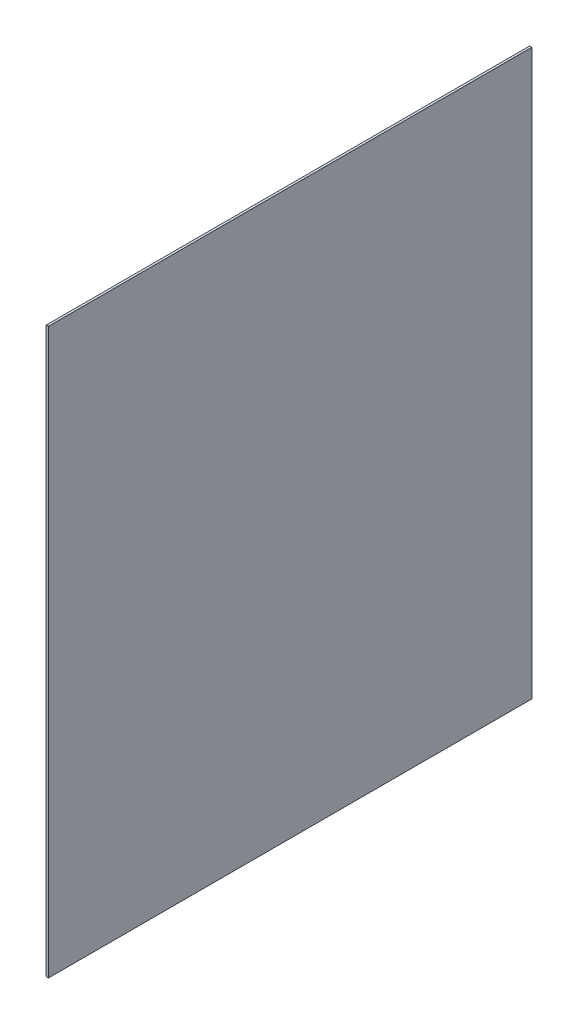
ISO-10303-21;
HEADER;
FILE_DESCRIPTION(('STEP AP214'),'2;1');
FILE_NAME('part.step','',(''),(''),'','','');
FILE_SCHEMA(('AUTOMOTIVE_DESIGN { 1 0 10303 214 1 1 1 1 }'));
ENDSEC;
DATA;
#1=APPLICATION_CONTEXT('core data for automotive mechanical design processes');
#2=APPLICATION_PROTOCOL_DEFINITION('international standard','automotive_design',2000,#1);
#3=PRODUCT_CONTEXT('',#1,'mechanical');
#4=PRODUCT('Part','Part','',(#3));
#5=PRODUCT_RELATED_PRODUCT_CATEGORY('part','',(#4));
#6=PRODUCT_DEFINITION_FORMATION('','',#4);
#7=PRODUCT_DEFINITION_CONTEXT('part definition',#1,'design');
#8=PRODUCT_DEFINITION('design','',#6,#7);
#9=PRODUCT_DEFINITION_SHAPE('','',#8);
#10=(LENGTH_UNIT() NAMED_UNIT(*) SI_UNIT(.MILLI.,.METRE.));
#11=(NAMED_UNIT(*) PLANE_ANGLE_UNIT() SI_UNIT($,.RADIAN.));
#12=(NAMED_UNIT(*) SI_UNIT($,.STERADIAN.) SOLID_ANGLE_UNIT());
#13=UNCERTAINTY_MEASURE_WITH_UNIT(LENGTH_MEASURE(1.E-05),#10,'distance_accuracy_value','');
#14=(GEOMETRIC_REPRESENTATION_CONTEXT(3) GLOBAL_UNCERTAINTY_ASSIGNED_CONTEXT((#13)) GLOBAL_UNIT_ASSIGNED_CONTEXT((#10,
#11,#12)) REPRESENTATION_CONTEXT('',''));
#15=CARTESIAN_POINT('',(0.,0.,0.));
#16=DIRECTION('',(0.,0.,1.));
#17=DIRECTION('',(1.,0.,0.));
#18=AXIS2_PLACEMENT_3D('',#15,#16,#17);
#19=CARTESIAN_POINT('',(1414.2,180.10748547765,159.995106228736));
#20=DIRECTION('',(0.,1.,0.));
#21=DIRECTION('',(0.,0.,1.));
#22=AXIS2_PLACEMENT_3D('',#19,#20,#21);
#23=PLANE('',#22);
#24=DIRECTION('',(0.,0.,-1.));
#25=VECTOR('',#24,1.);
#26=CARTESIAN_POINT('',(1412.7,180.10748547765,159.995106228736));
#27=LINE('',#26,#25);
#28=CARTESIAN_POINT('',(1412.7,180.10748547765,159.995106228736));
#29=VERTEX_POINT('',#28);
#30=CARTESIAN_POINT('',(1412.7,180.10748547765,-159.995106228736));
#31=VERTEX_POINT('',#30);
#32=EDGE_CURVE('E97',#29,#31,#27,.T.);
#33=ORIENTED_EDGE('',*,*,#32,.T.);
#34=DIRECTION('',(-1.,0.,0.));
#35=VECTOR('',#34,1.);
#36=CARTESIAN_POINT('',(1414.2,180.10748547765,-159.995106228736));
#37=LINE('',#36,#35);
#38=CARTESIAN_POINT('',(1414.2,180.10748547765,-159.995106228736));
#39=VERTEX_POINT('',#38);
#40=EDGE_CURVE('E11',#39,#31,#37,.T.);
#41=ORIENTED_EDGE('',*,*,#40,.F.);
#42=DIRECTION('',(0.,0.,-1.));
#43=VECTOR('',#42,1.);
#44=CARTESIAN_POINT('',(1414.2,180.10748547765,159.995106228736));
#45=LINE('',#44,#43);
#46=CARTESIAN_POINT('',(1414.2,180.10748547765,159.995106228736));
#47=VERTEX_POINT('',#46);
#48=EDGE_CURVE('E85',#47,#39,#45,.T.);
#49=ORIENTED_EDGE('',*,*,#48,.F.);
#50=DIRECTION('',(-1.,0.,0.));
#51=VECTOR('',#50,1.);
#52=CARTESIAN_POINT('',(1414.2,180.10748547765,159.995106228736));
#53=LINE('',#52,#51);
#54=EDGE_CURVE('E93',#47,#29,#53,.T.);
#55=ORIENTED_EDGE('',*,*,#54,.T.);
#56=EDGE_LOOP('',(#33,#41,#49,#55));
#57=FACE_BOUND('',#56,.T.);
#58=ADVANCED_FACE('F34',(#57),#23,.F.);
#59=CARTESIAN_POINT('',(1414.2,180.10748547765,-159.995106228736));
#60=DIRECTION('',(0.,3.51288808680108E-05,0.999999999382981));
#61=DIRECTION('',(0.,-0.999999999382981,3.51288808680108E-05));
#62=AXIS2_PLACEMENT_3D('',#59,#60,#61);
#63=PLANE('',#62);
#64=DIRECTION('',(0.,0.999999999382981,-3.51288808680108E-05));
#65=VECTOR('',#64,1.);
#66=CARTESIAN_POINT('',(1412.7,180.10748547765,-159.995106228736));
#67=LINE('',#66,#65);
#68=CARTESIAN_POINT('',(1412.7,553.761760902861,-160.008232285272));
#69=VERTEX_POINT('',#68);
#70=EDGE_CURVE('E89',#31,#69,#67,.T.);
#71=ORIENTED_EDGE('',*,*,#70,.T.);
#72=DIRECTION('',(-1.,0.,0.));
#73=VECTOR('',#72,1.);
#74=CARTESIAN_POINT('',(1414.2,553.761760902861,-160.008232285272));
#75=LINE('',#74,#73);
#76=CARTESIAN_POINT('',(1414.2,553.761760902861,-160.008232285272));
#77=VERTEX_POINT('',#76);
#78=EDGE_CURVE('E42',#77,#69,#75,.T.);
#79=ORIENTED_EDGE('',*,*,#78,.F.);
#80=DIRECTION('',(0.,0.999999999382981,-3.51288808680108E-05));
#81=VECTOR('',#80,1.);
#82=CARTESIAN_POINT('',(1414.2,180.10748547765,-159.995106228736));
#83=LINE('',#82,#81);
#84=EDGE_CURVE('E80',#39,#77,#83,.T.);
#85=ORIENTED_EDGE('',*,*,#84,.F.);
#86=ORIENTED_EDGE('',*,*,#40,.T.);
#87=EDGE_LOOP('',(#71,#79,#85,#86));
#88=FACE_BOUND('',#87,.T.);
#89=ADVANCED_FACE('F88',(#88),#63,.F.);
#90=CARTESIAN_POINT('',(1414.2,553.761760902861,-160.008232285272));
#91=DIRECTION('',(0.,-1.,0.));
#92=DIRECTION('',(0.,0.,-1.));
#93=AXIS2_PLACEMENT_3D('',#90,#91,#92);
#94=PLANE('',#93);
#95=DIRECTION('',(0.,0.,1.));
#96=VECTOR('',#95,1.);
#97=CARTESIAN_POINT('',(1412.7,553.761760902861,-160.008232285272));
#98=LINE('',#97,#96);
#99=CARTESIAN_POINT('',(1412.7,553.761760902861,160.008232285272));
#100=VERTEX_POINT('',#99);
#101=EDGE_CURVE('E67',#69,#100,#98,.T.);
#102=ORIENTED_EDGE('',*,*,#101,.T.);
#103=DIRECTION('',(-1.,0.,0.));
#104=VECTOR('',#103,1.);
#105=CARTESIAN_POINT('',(1414.2,553.761760902861,160.008232285272));
#106=LINE('',#105,#104);
#107=CARTESIAN_POINT('',(1414.2,553.761760902861,160.008232285272));
#108=VERTEX_POINT('',#107);
#109=EDGE_CURVE('E90',#108,#100,#106,.T.);
#110=ORIENTED_EDGE('',*,*,#109,.F.);
#111=DIRECTION('',(0.,0.,1.));
#112=VECTOR('',#111,1.);
#113=CARTESIAN_POINT('',(1414.2,553.761760902861,-160.008232285272));
#114=LINE('',#113,#112);
#115=EDGE_CURVE('E83',#77,#108,#114,.T.);
#116=ORIENTED_EDGE('',*,*,#115,.F.);
#117=ORIENTED_EDGE('',*,*,#78,.T.);
#118=EDGE_LOOP('',(#102,#110,#116,#117));
#119=FACE_BOUND('',#118,.T.);
#120=ADVANCED_FACE('F91',(#119),#94,.F.);
#121=CARTESIAN_POINT('',(1414.2,553.761760902861,160.008232285272));
#122=DIRECTION('',(0.,3.51288808680108E-05,-0.999999999382981));
#123=DIRECTION('',(0.,0.999999999382981,3.51288808680108E-05));
#124=AXIS2_PLACEMENT_3D('',#121,#122,#123);
#125=PLANE('',#124);
#126=DIRECTION('',(0.,-0.999999999382981,-3.51288808680108E-05));
#127=VECTOR('',#126,1.);
#128=CARTESIAN_POINT('',(1412.7,553.761760902861,160.008232285272));
#129=LINE('',#128,#127);
#130=EDGE_CURVE('E73',#100,#29,#129,.T.);
#131=ORIENTED_EDGE('',*,*,#130,.T.);
#132=ORIENTED_EDGE('',*,*,#54,.F.);
#133=DIRECTION('',(0.,-0.999999999382981,-3.51288808680108E-05));
#134=VECTOR('',#133,1.);
#135=CARTESIAN_POINT('',(1414.2,553.761760902861,160.008232285272));
#136=LINE('',#135,#134);
#137=EDGE_CURVE('E50',#108,#47,#136,.T.);
#138=ORIENTED_EDGE('',*,*,#137,.F.);
#139=ORIENTED_EDGE('',*,*,#109,.T.);
#140=EDGE_LOOP('',(#131,#132,#138,#139));
#141=FACE_BOUND('',#140,.T.);
#142=ADVANCED_FACE('F104',(#141),#125,.F.);
#143=CARTESIAN_POINT('',(1414.2,0.,0.));
#144=DIRECTION('',(1.,0.,0.));
#145=DIRECTION('',(0.,0.,-1.));
#146=AXIS2_PLACEMENT_3D('',#143,#144,#145);
#147=PLANE('',#146);
#148=ORIENTED_EDGE('',*,*,#48,.T.);
#149=ORIENTED_EDGE('',*,*,#84,.T.);
#150=ORIENTED_EDGE('',*,*,#115,.T.);
#151=ORIENTED_EDGE('',*,*,#137,.T.);
#152=EDGE_LOOP('',(#148,#149,#150,#151));
#153=FACE_BOUND('',#152,.T.);
#154=ADVANCED_FACE('F81',(#153),#147,.T.);
#155=CARTESIAN_POINT('',(1412.7,0.,0.));
#156=DIRECTION('',(1.,0.,0.));
#157=DIRECTION('',(0.,0.,-1.));
#158=AXIS2_PLACEMENT_3D('',#155,#156,#157);
#159=PLANE('',#158);
#160=ORIENTED_EDGE('',*,*,#32,.F.);
#161=ORIENTED_EDGE('',*,*,#130,.F.);
#162=ORIENTED_EDGE('',*,*,#101,.F.);
#163=ORIENTED_EDGE('',*,*,#70,.F.);
#164=EDGE_LOOP('',(#160,#161,#162,#163));
#165=FACE_BOUND('',#164,.T.);
#166=ADVANCED_FACE('F107',(#165),#159,.F.);
#167=CLOSED_SHELL('',(#58,#89,#120,#142,#154,#166));
#168=MANIFOLD_SOLID_BREP('B2',#167);
#169=ADVANCED_BREP_SHAPE_REPRESENTATION('',(#18,#168),#14);
#170=SHAPE_DEFINITION_REPRESENTATION(#9,#169);
ENDSEC;
END-ISO-10303-21;
